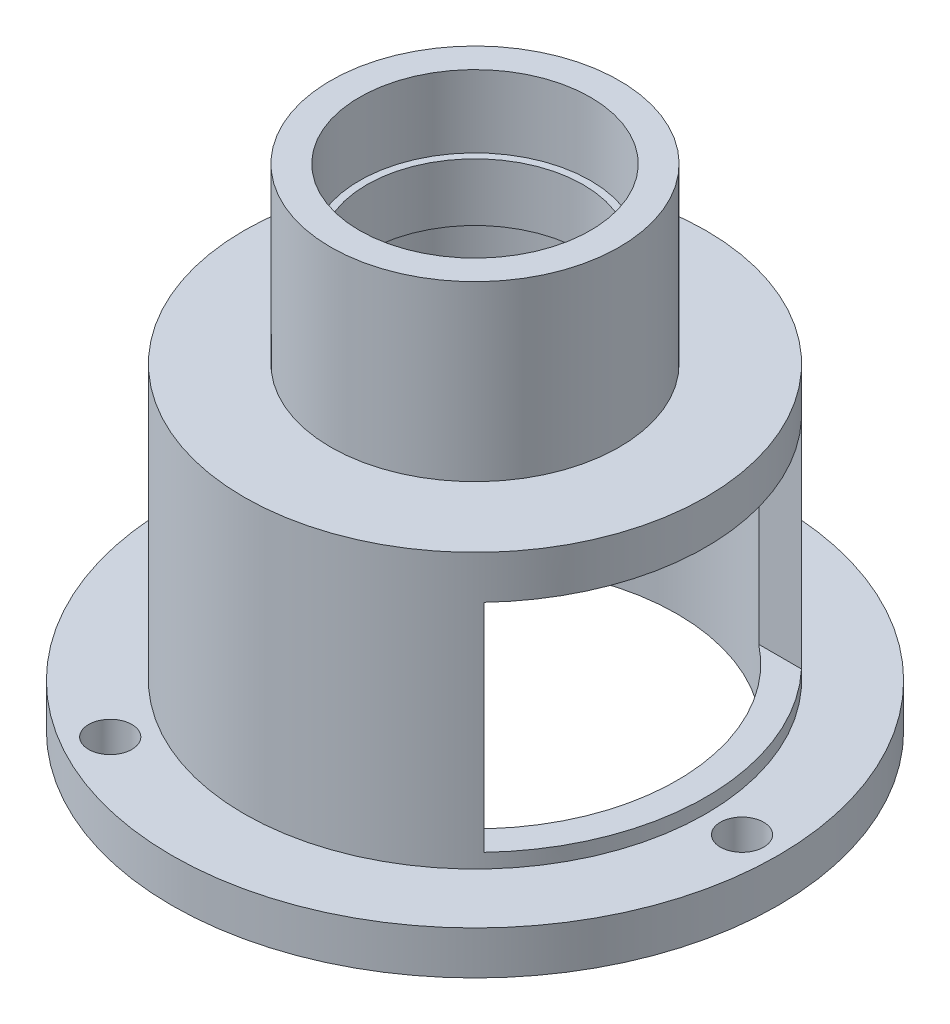
ISO-10303-21;
HEADER;
FILE_DESCRIPTION(('STEP AP214'),'2;1');
FILE_NAME('part.step','',(''),(''),'','','');
FILE_SCHEMA(('AUTOMOTIVE_DESIGN { 1 0 10303 214 1 1 1 1 }'));
ENDSEC;
DATA;
#1=APPLICATION_CONTEXT('core data for automotive mechanical design processes');
#2=APPLICATION_PROTOCOL_DEFINITION('international standard','automotive_design',2000,#1);
#3=PRODUCT_CONTEXT('',#1,'mechanical');
#4=PRODUCT('Part','Part','',(#3));
#5=PRODUCT_RELATED_PRODUCT_CATEGORY('part','',(#4));
#6=PRODUCT_DEFINITION_FORMATION('','',#4);
#7=PRODUCT_DEFINITION_CONTEXT('part definition',#1,'design');
#8=PRODUCT_DEFINITION('design','',#6,#7);
#9=PRODUCT_DEFINITION_SHAPE('','',#8);
#10=(LENGTH_UNIT() NAMED_UNIT(*) SI_UNIT(.MILLI.,.METRE.));
#11=(NAMED_UNIT(*) PLANE_ANGLE_UNIT() SI_UNIT($,.RADIAN.));
#12=(NAMED_UNIT(*) SI_UNIT($,.STERADIAN.) SOLID_ANGLE_UNIT());
#13=UNCERTAINTY_MEASURE_WITH_UNIT(LENGTH_MEASURE(1.E-05),#10,'distance_accuracy_value','');
#14=(GEOMETRIC_REPRESENTATION_CONTEXT(3) GLOBAL_UNCERTAINTY_ASSIGNED_CONTEXT((#13)) GLOBAL_UNIT_ASSIGNED_CONTEXT((#10,
#11,#12)) REPRESENTATION_CONTEXT('',''));
#15=CARTESIAN_POINT('',(0.,0.,0.));
#16=DIRECTION('',(0.,0.,1.));
#17=DIRECTION('',(1.,0.,0.));
#18=AXIS2_PLACEMENT_3D('',#15,#16,#17);
#19=CARTESIAN_POINT('',(0.,14.,0.));
#20=DIRECTION('',(0.,-1.,0.));
#21=DIRECTION('',(0.,0.,-1.));
#22=AXIS2_PLACEMENT_3D('',#19,#20,#21);
#23=CYLINDRICAL_SURFACE('',#22,16.);
#24=DIRECTION('',(0.,-1.,0.));
#25=VECTOR('',#24,1.);
#26=CARTESIAN_POINT('',(-11.6189500386223,14.,-11.));
#27=LINE('',#26,#25);
#28=CARTESIAN_POINT('',(-11.6189500386223,-16.,-11.));
#29=VERTEX_POINT('',#28);
#30=CARTESIAN_POINT('',(-11.6189500386222,-1.,-11.));
#31=VERTEX_POINT('',#30);
#32=EDGE_CURVE('E132',#29,#31,#27,.F.);
#33=ORIENTED_EDGE('',*,*,#32,.T.);
#34=CARTESIAN_POINT('',(0.,-0.999999999999997,0.));
#35=DIRECTION('',(0.,1.,0.));
#36=DIRECTION('',(-1.,0.,0.));
#37=AXIS2_PLACEMENT_3D('',#34,#35,#36);
#38=CIRCLE('',#37,16.);
#39=CARTESIAN_POINT('',(-11.6189500386222,-1.,11.));
#40=VERTEX_POINT('',#39);
#41=EDGE_CURVE('E135',#31,#40,#38,.T.);
#42=ORIENTED_EDGE('',*,*,#41,.T.);
#43=DIRECTION('',(0.,-1.,0.));
#44=VECTOR('',#43,1.);
#45=CARTESIAN_POINT('',(-11.6189500386223,14.,11.));
#46=LINE('',#45,#44);
#47=CARTESIAN_POINT('',(-11.6189500386223,-16.,11.));
#48=VERTEX_POINT('',#47);
#49=EDGE_CURVE('E125',#48,#40,#46,.F.);
#50=ORIENTED_EDGE('',*,*,#49,.F.);
#51=CARTESIAN_POINT('',(0.,-16.,0.));
#52=DIRECTION('',(0.,-1.,0.));
#53=DIRECTION('',(1.,0.,0.));
#54=AXIS2_PLACEMENT_3D('',#51,#52,#53);
#55=CIRCLE('',#54,16.);
#56=EDGE_CURVE('E137',#48,#29,#55,.T.);
#57=ORIENTED_EDGE('',*,*,#56,.T.);
#58=EDGE_LOOP('',(#33,#42,#50,#57));
#59=FACE_BOUND('',#58,.T.);
#60=CARTESIAN_POINT('',(0.,2.,0.));
#61=DIRECTION('',(0.,1.,0.));
#62=DIRECTION('',(0.,0.,1.));
#63=AXIS2_PLACEMENT_3D('',#60,#61,#62);
#64=CIRCLE('',#63,16.);
#65=CARTESIAN_POINT('',(0.,2.,16.));
#66=VERTEX_POINT('',#65);
#67=EDGE_CURVE('E176',#66,#66,#64,.T.);
#68=ORIENTED_EDGE('',*,*,#67,.F.);
#69=EDGE_LOOP('',(#68));
#70=FACE_BOUND('',#69,.T.);
#71=CARTESIAN_POINT('',(0.,-17.,0.));
#72=DIRECTION('',(0.,-1.,0.));
#73=DIRECTION('',(0.,0.,-1.));
#74=AXIS2_PLACEMENT_3D('',#71,#72,#73);
#75=CIRCLE('',#74,16.);
#76=CARTESIAN_POINT('',(0.,-17.,-16.));
#77=VERTEX_POINT('',#76);
#78=EDGE_CURVE('E163',#77,#77,#75,.T.);
#79=ORIENTED_EDGE('',*,*,#78,.F.);
#80=EDGE_LOOP('',(#79));
#81=FACE_BOUND('',#80,.T.);
#82=DIRECTION('',(0.,-1.,0.));
#83=VECTOR('',#82,1.);
#84=CARTESIAN_POINT('',(11.6189500386223,14.,-11.));
#85=LINE('',#84,#83);
#86=CARTESIAN_POINT('',(11.6189500386222,-1.,-11.));
#87=VERTEX_POINT('',#86);
#88=CARTESIAN_POINT('',(11.6189500386223,-16.,-11.));
#89=VERTEX_POINT('',#88);
#90=EDGE_CURVE('E98',#87,#89,#85,.T.);
#91=ORIENTED_EDGE('',*,*,#90,.T.);
#92=CARTESIAN_POINT('',(0.,-16.,0.));
#93=DIRECTION('',(0.,1.,0.));
#94=DIRECTION('',(-1.,0.,0.));
#95=AXIS2_PLACEMENT_3D('',#92,#93,#94);
#96=CIRCLE('',#95,16.);
#97=CARTESIAN_POINT('',(11.6189500386223,-16.,11.));
#98=VERTEX_POINT('',#97);
#99=EDGE_CURVE('E104',#98,#89,#96,.T.);
#100=ORIENTED_EDGE('',*,*,#99,.F.);
#101=DIRECTION('',(0.,-1.,0.));
#102=VECTOR('',#101,1.);
#103=CARTESIAN_POINT('',(11.6189500386223,14.,11.));
#104=LINE('',#103,#102);
#105=CARTESIAN_POINT('',(11.6189500386223,-0.999999999999997,11.));
#106=VERTEX_POINT('',#105);
#107=EDGE_CURVE('E94',#106,#98,#104,.T.);
#108=ORIENTED_EDGE('',*,*,#107,.F.);
#109=CARTESIAN_POINT('',(0.,-0.999999999999997,0.));
#110=DIRECTION('',(0.,-1.,0.));
#111=DIRECTION('',(1.,0.,0.));
#112=AXIS2_PLACEMENT_3D('',#109,#110,#111);
#113=CIRCLE('',#112,16.);
#114=EDGE_CURVE('E112',#87,#106,#113,.T.);
#115=ORIENTED_EDGE('',*,*,#114,.F.);
#116=EDGE_LOOP('',(#91,#100,#108,#115));
#117=FACE_BOUND('',#116,.T.);
#118=ADVANCED_FACE('F34',(#59,#70,#81,#117),#23,.T.);
#119=CARTESIAN_POINT('',(0.,14.,0.));
#120=DIRECTION('',(0.,-1.,0.));
#121=DIRECTION('',(0.,0.,-1.));
#122=AXIS2_PLACEMENT_3D('',#119,#120,#121);
#123=CYLINDRICAL_SURFACE('',#122,8.);
#124=CARTESIAN_POINT('',(0.,14.,0.));
#125=DIRECTION('',(0.,1.,0.));
#126=DIRECTION('',(0.,0.,1.));
#127=AXIS2_PLACEMENT_3D('',#124,#125,#126);
#128=CIRCLE('',#127,8.);
#129=CARTESIAN_POINT('',(0.,14.,8.));
#130=VERTEX_POINT('',#129);
#131=EDGE_CURVE('E180',#130,#130,#128,.T.);
#132=ORIENTED_EDGE('',*,*,#131,.T.);
#133=EDGE_LOOP('',(#132));
#134=FACE_BOUND('',#133,.T.);
#135=CARTESIAN_POINT('',(0.,9.,0.));
#136=DIRECTION('',(0.,-1.,0.));
#137=DIRECTION('',(0.,0.,-1.));
#138=AXIS2_PLACEMENT_3D('',#135,#136,#137);
#139=CIRCLE('',#138,8.);
#140=CARTESIAN_POINT('',(0.,9.,-8.));
#141=VERTEX_POINT('',#140);
#142=EDGE_CURVE('E170',#141,#141,#139,.T.);
#143=ORIENTED_EDGE('',*,*,#142,.T.);
#144=EDGE_LOOP('',(#143));
#145=FACE_BOUND('',#144,.T.);
#146=ADVANCED_FACE('F235',(#134,#145),#123,.F.);
#147=CARTESIAN_POINT('',(0.,14.,0.));
#148=DIRECTION('',(0.,1.,0.));
#149=DIRECTION('',(0.,0.,1.));
#150=AXIS2_PLACEMENT_3D('',#147,#148,#149);
#151=PLANE('',#150);
#152=ORIENTED_EDGE('',*,*,#131,.F.);
#153=EDGE_LOOP('',(#152));
#154=FACE_BOUND('',#153,.T.);
#155=CARTESIAN_POINT('',(0.,14.,0.));
#156=DIRECTION('',(0.,1.,0.));
#157=DIRECTION('',(0.,0.,1.));
#158=AXIS2_PLACEMENT_3D('',#155,#156,#157);
#159=CIRCLE('',#158,10.);
#160=CARTESIAN_POINT('',(0.,14.,10.));
#161=VERTEX_POINT('',#160);
#162=EDGE_CURVE('E177',#161,#161,#159,.T.);
#163=ORIENTED_EDGE('',*,*,#162,.T.);
#164=EDGE_LOOP('',(#163));
#165=FACE_BOUND('',#164,.T.);
#166=ADVANCED_FACE('F240',(#154,#165),#151,.T.);
#167=CARTESIAN_POINT('',(0.,0.,0.));
#168=DIRECTION('',(0.,1.,0.));
#169=DIRECTION('',(0.,0.,1.));
#170=AXIS2_PLACEMENT_3D('',#167,#168,#169);
#171=PLANE('',#170);
#172=CARTESIAN_POINT('',(0.,0.,0.));
#173=DIRECTION('',(0.,-1.,0.));
#174=DIRECTION('',(0.,0.,-1.));
#175=AXIS2_PLACEMENT_3D('',#172,#173,#174);
#176=CIRCLE('',#175,14.);
#177=CARTESIAN_POINT('',(0.,0.,-14.));
#178=VERTEX_POINT('',#177);
#179=EDGE_CURVE('E158',#178,#178,#176,.T.);
#180=ORIENTED_EDGE('',*,*,#179,.T.);
#181=EDGE_LOOP('',(#180));
#182=FACE_BOUND('',#181,.T.);
#183=CARTESIAN_POINT('',(0.,0.,0.));
#184=DIRECTION('',(0.,1.,0.));
#185=DIRECTION('',(0.,0.,1.));
#186=AXIS2_PLACEMENT_3D('',#183,#184,#185);
#187=CIRCLE('',#186,8.);
#188=CARTESIAN_POINT('',(0.,0.,8.));
#189=VERTEX_POINT('',#188);
#190=EDGE_CURVE('E184',#189,#189,#187,.T.);
#191=ORIENTED_EDGE('',*,*,#190,.T.);
#192=EDGE_LOOP('',(#191));
#193=FACE_BOUND('',#192,.T.);
#194=ADVANCED_FACE('F292',(#182,#193),#171,.F.);
#195=CARTESIAN_POINT('',(0.,5.,0.));
#196=DIRECTION('',(0.,-1.,0.));
#197=DIRECTION('',(0.,0.,-1.));
#198=AXIS2_PLACEMENT_3D('',#195,#196,#197);
#199=CIRCLE('',#198,8.);
#200=CARTESIAN_POINT('',(0.,5.,-8.));
#201=VERTEX_POINT('',#200);
#202=EDGE_CURVE('E183',#201,#201,#199,.T.);
#203=ORIENTED_EDGE('',*,*,#202,.F.);
#204=EDGE_LOOP('',(#203));
#205=FACE_BOUND('',#204,.T.);
#206=ORIENTED_EDGE('',*,*,#190,.F.);
#207=EDGE_LOOP('',(#206));
#208=FACE_BOUND('',#207,.T.);
#209=ADVANCED_FACE('F243',(#205,#208),#123,.F.);
#210=CARTESIAN_POINT('',(0.,2.,0.));
#211=DIRECTION('',(0.,1.,0.));
#212=DIRECTION('',(0.,0.,1.));
#213=AXIS2_PLACEMENT_3D('',#210,#211,#212);
#214=PLANE('',#213);
#215=CARTESIAN_POINT('',(0.,2.,0.));
#216=DIRECTION('',(0.,1.,0.));
#217=DIRECTION('',(0.,0.,1.));
#218=AXIS2_PLACEMENT_3D('',#215,#216,#217);
#219=CIRCLE('',#218,10.);
#220=CARTESIAN_POINT('',(0.,2.,10.));
#221=VERTEX_POINT('',#220);
#222=EDGE_CURVE('E173',#221,#221,#219,.T.);
#223=ORIENTED_EDGE('',*,*,#222,.F.);
#224=EDGE_LOOP('',(#223));
#225=FACE_BOUND('',#224,.T.);
#226=ORIENTED_EDGE('',*,*,#67,.T.);
#227=EDGE_LOOP('',(#226));
#228=FACE_BOUND('',#227,.T.);
#229=ADVANCED_FACE('F286',(#225,#228),#214,.T.);
#230=CARTESIAN_POINT('',(0.,2.,0.));
#231=DIRECTION('',(0.,1.,0.));
#232=DIRECTION('',(0.,0.,1.));
#233=AXIS2_PLACEMENT_3D('',#230,#231,#232);
#234=CYLINDRICAL_SURFACE('',#233,10.);
#235=ORIENTED_EDGE('',*,*,#222,.T.);
#236=EDGE_LOOP('',(#235));
#237=FACE_BOUND('',#236,.T.);
#238=ORIENTED_EDGE('',*,*,#162,.F.);
#239=EDGE_LOOP('',(#238));
#240=FACE_BOUND('',#239,.T.);
#241=ADVANCED_FACE('F279',(#237,#240),#234,.T.);
#242=CARTESIAN_POINT('',(0.,9.,0.));
#243=DIRECTION('',(0.,-1.,0.));
#244=DIRECTION('',(0.,0.,-1.));
#245=AXIS2_PLACEMENT_3D('',#242,#243,#244);
#246=PLANE('',#245);
#247=ORIENTED_EDGE('',*,*,#142,.F.);
#248=EDGE_LOOP('',(#247));
#249=FACE_BOUND('',#248,.T.);
#250=CARTESIAN_POINT('',(0.,9.,0.));
#251=DIRECTION('',(0.,-1.,0.));
#252=DIRECTION('',(0.,0.,-1.));
#253=AXIS2_PLACEMENT_3D('',#250,#251,#252);
#254=CIRCLE('',#253,7.5);
#255=CARTESIAN_POINT('',(0.,9.,-7.5));
#256=VERTEX_POINT('',#255);
#257=EDGE_CURVE('E167',#256,#256,#254,.T.);
#258=ORIENTED_EDGE('',*,*,#257,.T.);
#259=EDGE_LOOP('',(#258));
#260=FACE_BOUND('',#259,.T.);
#261=ADVANCED_FACE('F276',(#249,#260),#246,.F.);
#262=CARTESIAN_POINT('',(0.,5.,0.));
#263=DIRECTION('',(0.,-1.,0.));
#264=DIRECTION('',(0.,0.,-1.));
#265=AXIS2_PLACEMENT_3D('',#262,#263,#264);
#266=PLANE('',#265);
#267=ORIENTED_EDGE('',*,*,#202,.T.);
#268=EDGE_LOOP('',(#267));
#269=FACE_BOUND('',#268,.T.);
#270=CARTESIAN_POINT('',(0.,5.,0.));
#271=DIRECTION('',(0.,-1.,0.));
#272=DIRECTION('',(0.,0.,-1.));
#273=AXIS2_PLACEMENT_3D('',#270,#271,#272);
#274=CIRCLE('',#273,7.5);
#275=CARTESIAN_POINT('',(0.,5.,-7.5));
#276=VERTEX_POINT('',#275);
#277=EDGE_CURVE('E166',#276,#276,#274,.T.);
#278=ORIENTED_EDGE('',*,*,#277,.F.);
#279=EDGE_LOOP('',(#278));
#280=FACE_BOUND('',#279,.T.);
#281=ADVANCED_FACE('F274',(#269,#280),#266,.T.);
#282=CARTESIAN_POINT('',(0.,9.,0.));
#283=DIRECTION('',(0.,-1.,0.));
#284=DIRECTION('',(0.,0.,-1.));
#285=AXIS2_PLACEMENT_3D('',#282,#283,#284);
#286=CYLINDRICAL_SURFACE('',#285,7.5);
#287=ORIENTED_EDGE('',*,*,#257,.F.);
#288=EDGE_LOOP('',(#287));
#289=FACE_BOUND('',#288,.T.);
#290=ORIENTED_EDGE('',*,*,#277,.T.);
#291=EDGE_LOOP('',(#290));
#292=FACE_BOUND('',#291,.T.);
#293=ADVANCED_FACE('F262',(#289,#292),#286,.F.);
#294=CARTESIAN_POINT('',(0.,-17.,0.));
#295=DIRECTION('',(0.,1.,0.));
#296=DIRECTION('',(0.,0.,1.));
#297=AXIS2_PLACEMENT_3D('',#294,#295,#296);
#298=CYLINDRICAL_SURFACE('',#297,14.);
#299=DIRECTION('',(0.,1.,0.));
#300=VECTOR('',#299,1.);
#301=CARTESIAN_POINT('',(8.66025403784439,-17.,-11.));
#302=LINE('',#301,#300);
#303=CARTESIAN_POINT('',(8.66025403784439,-1.,-11.));
#304=VERTEX_POINT('',#303);
#305=CARTESIAN_POINT('',(8.66025403784439,-16.,-11.));
#306=VERTEX_POINT('',#305);
#307=EDGE_CURVE('E11',#304,#306,#302,.F.);
#308=ORIENTED_EDGE('',*,*,#307,.F.);
#309=CARTESIAN_POINT('',(0.,-0.999999999999997,0.));
#310=DIRECTION('',(0.,-1.,0.));
#311=DIRECTION('',(1.,0.,0.));
#312=AXIS2_PLACEMENT_3D('',#309,#310,#311);
#313=CIRCLE('',#312,14.);
#314=CARTESIAN_POINT('',(8.66025403784439,-1.,11.));
#315=VERTEX_POINT('',#314);
#316=EDGE_CURVE('E41',#304,#315,#313,.T.);
#317=ORIENTED_EDGE('',*,*,#316,.T.);
#318=DIRECTION('',(0.,1.,0.));
#319=VECTOR('',#318,1.);
#320=CARTESIAN_POINT('',(8.66025403784439,-17.,11.));
#321=LINE('',#320,#319);
#322=CARTESIAN_POINT('',(8.66025403784439,-16.,11.));
#323=VERTEX_POINT('',#322);
#324=EDGE_CURVE('E209',#315,#323,#321,.F.);
#325=ORIENTED_EDGE('',*,*,#324,.T.);
#326=CARTESIAN_POINT('',(0.,-16.,0.));
#327=DIRECTION('',(0.,1.,0.));
#328=DIRECTION('',(-1.,0.,0.));
#329=AXIS2_PLACEMENT_3D('',#326,#327,#328);
#330=CIRCLE('',#329,14.);
#331=EDGE_CURVE('E107',#323,#306,#330,.T.);
#332=ORIENTED_EDGE('',*,*,#331,.T.);
#333=EDGE_LOOP('',(#308,#317,#325,#332));
#334=FACE_BOUND('',#333,.T.);
#335=DIRECTION('',(0.,1.,0.));
#336=VECTOR('',#335,1.);
#337=CARTESIAN_POINT('',(-8.66025403784439,-17.,-11.));
#338=LINE('',#337,#336);
#339=CARTESIAN_POINT('',(-8.66025403784439,-16.,-11.));
#340=VERTEX_POINT('',#339);
#341=CARTESIAN_POINT('',(-8.66025403784439,-1.,-11.));
#342=VERTEX_POINT('',#341);
#343=EDGE_CURVE('E207',#340,#342,#338,.T.);
#344=ORIENTED_EDGE('',*,*,#343,.F.);
#345=CARTESIAN_POINT('',(0.,-16.,0.));
#346=DIRECTION('',(0.,-1.,0.));
#347=DIRECTION('',(1.,0.,0.));
#348=AXIS2_PLACEMENT_3D('',#345,#346,#347);
#349=CIRCLE('',#348,14.);
#350=CARTESIAN_POINT('',(-8.66025403784439,-16.,11.));
#351=VERTEX_POINT('',#350);
#352=EDGE_CURVE('E205',#351,#340,#349,.T.);
#353=ORIENTED_EDGE('',*,*,#352,.F.);
#354=DIRECTION('',(0.,1.,0.));
#355=VECTOR('',#354,1.);
#356=CARTESIAN_POINT('',(-8.66025403784439,-17.,11.));
#357=LINE('',#356,#355);
#358=CARTESIAN_POINT('',(-8.66025403784439,-0.999999999999997,11.));
#359=VERTEX_POINT('',#358);
#360=EDGE_CURVE('E191',#351,#359,#357,.T.);
#361=ORIENTED_EDGE('',*,*,#360,.T.);
#362=CARTESIAN_POINT('',(0.,-0.999999999999997,0.));
#363=DIRECTION('',(0.,1.,0.));
#364=DIRECTION('',(-1.,0.,0.));
#365=AXIS2_PLACEMENT_3D('',#362,#363,#364);
#366=CIRCLE('',#365,14.);
#367=EDGE_CURVE('E202',#342,#359,#366,.T.);
#368=ORIENTED_EDGE('',*,*,#367,.F.);
#369=EDGE_LOOP('',(#344,#353,#361,#368));
#370=FACE_BOUND('',#369,.T.);
#371=ORIENTED_EDGE('',*,*,#179,.F.);
#372=EDGE_LOOP('',(#371));
#373=FACE_BOUND('',#372,.T.);
#374=CARTESIAN_POINT('',(0.,-20.,0.));
#375=DIRECTION('',(0.,-1.,0.));
#376=DIRECTION('',(0.,0.,-1.));
#377=AXIS2_PLACEMENT_3D('',#374,#375,#376);
#378=CIRCLE('',#377,14.);
#379=CARTESIAN_POINT('',(0.,-20.,-14.));
#380=VERTEX_POINT('',#379);
#381=EDGE_CURVE('E151',#380,#380,#378,.T.);
#382=ORIENTED_EDGE('',*,*,#381,.T.);
#383=EDGE_LOOP('',(#382));
#384=FACE_BOUND('',#383,.T.);
#385=ADVANCED_FACE('F214',(#334,#370,#373,#384),#298,.F.);
#386=CARTESIAN_POINT('',(0.,-17.,0.));
#387=DIRECTION('',(0.,-1.,0.));
#388=DIRECTION('',(0.,0.,-1.));
#389=AXIS2_PLACEMENT_3D('',#386,#387,#388);
#390=PLANE('',#389);
#391=CARTESIAN_POINT('',(-9.24999999999985,-17.,-16.0214699700122));
#392=DIRECTION('',(0.,1.,0.));
#393=DIRECTION('',(0.,0.,1.));
#394=AXIS2_PLACEMENT_3D('',#391,#392,#393);
#395=CIRCLE('',#394,1.5);
#396=CARTESIAN_POINT('',(-9.24999999999985,-17.,-14.5214699700122));
#397=VERTEX_POINT('',#396);
#398=EDGE_CURVE('E139',#397,#397,#395,.T.);
#399=ORIENTED_EDGE('',*,*,#398,.F.);
#400=EDGE_LOOP('',(#399));
#401=FACE_BOUND('',#400,.T.);
#402=CARTESIAN_POINT('',(-9.25000000000008,-17.,16.0214699700121));
#403=DIRECTION('',(0.,1.,0.));
#404=DIRECTION('',(0.,0.,1.));
#405=AXIS2_PLACEMENT_3D('',#402,#403,#404);
#406=CIRCLE('',#405,1.5);
#407=CARTESIAN_POINT('',(-9.25000000000008,-17.,17.5214699700121));
#408=VERTEX_POINT('',#407);
#409=EDGE_CURVE('E143',#408,#408,#406,.T.);
#410=ORIENTED_EDGE('',*,*,#409,.F.);
#411=EDGE_LOOP('',(#410));
#412=FACE_BOUND('',#411,.T.);
#413=CARTESIAN_POINT('',(18.5,-17.,0.));
#414=DIRECTION('',(0.,1.,0.));
#415=DIRECTION('',(0.,0.,1.));
#416=AXIS2_PLACEMENT_3D('',#413,#414,#415);
#417=CIRCLE('',#416,1.5);
#418=CARTESIAN_POINT('',(18.5,-17.,1.5));
#419=VERTEX_POINT('',#418);
#420=EDGE_CURVE('E147',#419,#419,#417,.T.);
#421=ORIENTED_EDGE('',*,*,#420,.F.);
#422=EDGE_LOOP('',(#421));
#423=FACE_BOUND('',#422,.T.);
#424=CARTESIAN_POINT('',(0.,-17.,0.));
#425=DIRECTION('',(0.,-1.,0.));
#426=DIRECTION('',(0.,0.,-1.));
#427=AXIS2_PLACEMENT_3D('',#424,#425,#426);
#428=CIRCLE('',#427,21.);
#429=CARTESIAN_POINT('',(0.,-17.,-21.));
#430=VERTEX_POINT('',#429);
#431=EDGE_CURVE('E154',#430,#430,#428,.T.);
#432=ORIENTED_EDGE('',*,*,#431,.F.);
#433=EDGE_LOOP('',(#432));
#434=FACE_BOUND('',#433,.T.);
#435=ORIENTED_EDGE('',*,*,#78,.T.);
#436=EDGE_LOOP('',(#435));
#437=FACE_BOUND('',#436,.T.);
#438=ADVANCED_FACE('F250',(#401,#412,#423,#434,#437),#390,.F.);
#439=CARTESIAN_POINT('',(0.,-20.,0.));
#440=DIRECTION('',(0.,-1.,0.));
#441=DIRECTION('',(0.,0.,-1.));
#442=AXIS2_PLACEMENT_3D('',#439,#440,#441);
#443=PLANE('',#442);
#444=CARTESIAN_POINT('',(-9.24999999999985,-20.,-16.0214699700122));
#445=DIRECTION('',(0.,-1.,0.));
#446=DIRECTION('',(0.,0.,-1.));
#447=AXIS2_PLACEMENT_3D('',#444,#445,#446);
#448=CIRCLE('',#447,1.5);
#449=CARTESIAN_POINT('',(-9.24999999999985,-20.,-17.5214699700122));
#450=VERTEX_POINT('',#449);
#451=EDGE_CURVE('E142',#450,#450,#448,.T.);
#452=ORIENTED_EDGE('',*,*,#451,.F.);
#453=EDGE_LOOP('',(#452));
#454=FACE_BOUND('',#453,.T.);
#455=CARTESIAN_POINT('',(-9.25000000000008,-20.,16.0214699700121));
#456=DIRECTION('',(0.,-1.,0.));
#457=DIRECTION('',(0.,0.,-1.));
#458=AXIS2_PLACEMENT_3D('',#455,#456,#457);
#459=CIRCLE('',#458,1.5);
#460=CARTESIAN_POINT('',(-9.25000000000008,-20.,14.5214699700121));
#461=VERTEX_POINT('',#460);
#462=EDGE_CURVE('E146',#461,#461,#459,.T.);
#463=ORIENTED_EDGE('',*,*,#462,.F.);
#464=EDGE_LOOP('',(#463));
#465=FACE_BOUND('',#464,.T.);
#466=CARTESIAN_POINT('',(18.5,-20.,0.));
#467=DIRECTION('',(0.,-1.,0.));
#468=DIRECTION('',(0.,0.,-1.));
#469=AXIS2_PLACEMENT_3D('',#466,#467,#468);
#470=CIRCLE('',#469,1.5);
#471=CARTESIAN_POINT('',(18.5,-20.,-1.5));
#472=VERTEX_POINT('',#471);
#473=EDGE_CURVE('E150',#472,#472,#470,.T.);
#474=ORIENTED_EDGE('',*,*,#473,.F.);
#475=EDGE_LOOP('',(#474));
#476=FACE_BOUND('',#475,.T.);
#477=CARTESIAN_POINT('',(0.,-20.,0.));
#478=DIRECTION('',(0.,-1.,0.));
#479=DIRECTION('',(0.,0.,-1.));
#480=AXIS2_PLACEMENT_3D('',#477,#478,#479);
#481=CIRCLE('',#480,21.);
#482=CARTESIAN_POINT('',(0.,-20.,-21.));
#483=VERTEX_POINT('',#482);
#484=EDGE_CURVE('E155',#483,#483,#481,.T.);
#485=ORIENTED_EDGE('',*,*,#484,.T.);
#486=EDGE_LOOP('',(#485));
#487=FACE_BOUND('',#486,.T.);
#488=ORIENTED_EDGE('',*,*,#381,.F.);
#489=EDGE_LOOP('',(#488));
#490=FACE_BOUND('',#489,.T.);
#491=ADVANCED_FACE('F252',(#454,#465,#476,#487,#490),#443,.T.);
#492=CARTESIAN_POINT('',(0.,-20.,0.));
#493=DIRECTION('',(0.,1.,0.));
#494=DIRECTION('',(0.,0.,1.));
#495=AXIS2_PLACEMENT_3D('',#492,#493,#494);
#496=CYLINDRICAL_SURFACE('',#495,21.);
#497=ORIENTED_EDGE('',*,*,#484,.F.);
#498=EDGE_LOOP('',(#497));
#499=FACE_BOUND('',#498,.T.);
#500=ORIENTED_EDGE('',*,*,#431,.T.);
#501=EDGE_LOOP('',(#500));
#502=FACE_BOUND('',#501,.T.);
#503=ADVANCED_FACE('F259',(#499,#502),#496,.T.);
#504=CARTESIAN_POINT('',(18.5,-27.,0.));
#505=DIRECTION('',(0.,1.,0.));
#506=DIRECTION('',(0.,0.,1.));
#507=AXIS2_PLACEMENT_3D('',#504,#505,#506);
#508=CYLINDRICAL_SURFACE('',#507,1.5);
#509=ORIENTED_EDGE('',*,*,#473,.T.);
#510=EDGE_LOOP('',(#509));
#511=FACE_BOUND('',#510,.T.);
#512=ORIENTED_EDGE('',*,*,#420,.T.);
#513=EDGE_LOOP('',(#512));
#514=FACE_BOUND('',#513,.T.);
#515=ADVANCED_FACE('F269',(#511,#514),#508,.F.);
#516=CARTESIAN_POINT('',(-9.25000000000008,-27.,16.0214699700121));
#517=DIRECTION('',(0.,1.,0.));
#518=DIRECTION('',(0.,0.,1.));
#519=AXIS2_PLACEMENT_3D('',#516,#517,#518);
#520=CYLINDRICAL_SURFACE('',#519,1.5);
#521=ORIENTED_EDGE('',*,*,#462,.T.);
#522=EDGE_LOOP('',(#521));
#523=FACE_BOUND('',#522,.T.);
#524=ORIENTED_EDGE('',*,*,#409,.T.);
#525=EDGE_LOOP('',(#524));
#526=FACE_BOUND('',#525,.T.);
#527=ADVANCED_FACE('F409',(#523,#526),#520,.F.);
#528=CARTESIAN_POINT('',(-9.24999999999985,-27.,-16.0214699700122));
#529=DIRECTION('',(0.,1.,0.));
#530=DIRECTION('',(0.,0.,1.));
#531=AXIS2_PLACEMENT_3D('',#528,#529,#530);
#532=CYLINDRICAL_SURFACE('',#531,1.5);
#533=ORIENTED_EDGE('',*,*,#451,.T.);
#534=EDGE_LOOP('',(#533));
#535=FACE_BOUND('',#534,.T.);
#536=ORIENTED_EDGE('',*,*,#398,.T.);
#537=EDGE_LOOP('',(#536));
#538=FACE_BOUND('',#537,.T.);
#539=ADVANCED_FACE('F401',(#535,#538),#532,.F.);
#540=CARTESIAN_POINT('',(-1.,-16.,-11.));
#541=DIRECTION('',(0.,-1.,0.));
#542=DIRECTION('',(1.,0.,0.));
#543=AXIS2_PLACEMENT_3D('',#540,#541,#542);
#544=PLANE('',#543);
#545=DIRECTION('',(1.,0.,0.));
#546=VECTOR('',#545,1.);
#547=CARTESIAN_POINT('',(-1.,-16.,11.));
#548=LINE('',#547,#546);
#549=EDGE_CURVE('E122',#48,#351,#548,.T.);
#550=ORIENTED_EDGE('',*,*,#549,.T.);
#551=ORIENTED_EDGE('',*,*,#352,.T.);
#552=DIRECTION('',(1.,0.,0.));
#553=VECTOR('',#552,1.);
#554=CARTESIAN_POINT('',(-1.,-16.,-11.));
#555=LINE('',#554,#553);
#556=EDGE_CURVE('E121',#29,#340,#555,.T.);
#557=ORIENTED_EDGE('',*,*,#556,.F.);
#558=ORIENTED_EDGE('',*,*,#56,.F.);
#559=EDGE_LOOP('',(#550,#551,#557,#558));
#560=FACE_BOUND('',#559,.T.);
#561=ADVANCED_FACE('F393',(#560),#544,.F.);
#562=CARTESIAN_POINT('',(-1.,-0.999999999999997,-11.));
#563=DIRECTION('',(0.,1.,0.));
#564=DIRECTION('',(-1.,0.,0.));
#565=AXIS2_PLACEMENT_3D('',#562,#563,#564);
#566=PLANE('',#565);
#567=ORIENTED_EDGE('',*,*,#41,.F.);
#568=DIRECTION('',(-1.,0.,0.));
#569=VECTOR('',#568,1.);
#570=CARTESIAN_POINT('',(-1.,-0.999999999999997,-11.));
#571=LINE('',#570,#569);
#572=EDGE_CURVE('E118',#342,#31,#571,.T.);
#573=ORIENTED_EDGE('',*,*,#572,.F.);
#574=ORIENTED_EDGE('',*,*,#367,.T.);
#575=DIRECTION('',(-1.,0.,0.));
#576=VECTOR('',#575,1.);
#577=CARTESIAN_POINT('',(-1.,-0.999999999999997,11.));
#578=LINE('',#577,#576);
#579=EDGE_CURVE('E114',#359,#40,#578,.T.);
#580=ORIENTED_EDGE('',*,*,#579,.T.);
#581=EDGE_LOOP('',(#567,#573,#574,#580));
#582=FACE_BOUND('',#581,.T.);
#583=ADVANCED_FACE('F385',(#582),#566,.F.);
#584=CARTESIAN_POINT('',(0.,0.,-11.));
#585=DIRECTION('',(0.,0.,-1.));
#586=DIRECTION('',(-1.,0.,0.));
#587=AXIS2_PLACEMENT_3D('',#584,#585,#586);
#588=PLANE('',#587);
#589=ORIENTED_EDGE('',*,*,#556,.T.);
#590=ORIENTED_EDGE('',*,*,#343,.T.);
#591=ORIENTED_EDGE('',*,*,#572,.T.);
#592=ORIENTED_EDGE('',*,*,#32,.F.);
#593=EDGE_LOOP('',(#589,#590,#591,#592));
#594=FACE_BOUND('',#593,.T.);
#595=ADVANCED_FACE('F377',(#594),#588,.F.);
#596=CARTESIAN_POINT('',(0.,0.,11.));
#597=DIRECTION('',(0.,0.,-1.));
#598=DIRECTION('',(-1.,0.,0.));
#599=AXIS2_PLACEMENT_3D('',#596,#597,#598);
#600=PLANE('',#599);
#601=ORIENTED_EDGE('',*,*,#49,.T.);
#602=ORIENTED_EDGE('',*,*,#579,.F.);
#603=ORIENTED_EDGE('',*,*,#360,.F.);
#604=ORIENTED_EDGE('',*,*,#549,.F.);
#605=EDGE_LOOP('',(#601,#602,#603,#604));
#606=FACE_BOUND('',#605,.T.);
#607=ADVANCED_FACE('F354',(#606),#600,.T.);
#608=CARTESIAN_POINT('',(1.,-0.999999999999997,-11.));
#609=DIRECTION('',(0.,-1.,0.));
#610=DIRECTION('',(1.,0.,0.));
#611=AXIS2_PLACEMENT_3D('',#608,#609,#610);
#612=PLANE('',#611);
#613=ORIENTED_EDGE('',*,*,#114,.T.);
#614=DIRECTION('',(1.,0.,0.));
#615=VECTOR('',#614,1.);
#616=CARTESIAN_POINT('',(1.,-0.999999999999997,11.));
#617=LINE('',#616,#615);
#618=EDGE_CURVE('E48',#315,#106,#617,.T.);
#619=ORIENTED_EDGE('',*,*,#618,.F.);
#620=ORIENTED_EDGE('',*,*,#316,.F.);
#621=DIRECTION('',(1.,0.,0.));
#622=VECTOR('',#621,1.);
#623=CARTESIAN_POINT('',(1.,-0.999999999999997,-11.));
#624=LINE('',#623,#622);
#625=EDGE_CURVE('E99',#304,#87,#624,.T.);
#626=ORIENTED_EDGE('',*,*,#625,.T.);
#627=EDGE_LOOP('',(#613,#619,#620,#626));
#628=FACE_BOUND('',#627,.T.);
#629=ADVANCED_FACE('F219',(#628),#612,.T.);
#630=CARTESIAN_POINT('',(1.,-16.,-11.));
#631=DIRECTION('',(0.,1.,0.));
#632=DIRECTION('',(-1.,0.,0.));
#633=AXIS2_PLACEMENT_3D('',#630,#631,#632);
#634=PLANE('',#633);
#635=ORIENTED_EDGE('',*,*,#99,.T.);
#636=DIRECTION('',(-1.,0.,0.));
#637=VECTOR('',#636,1.);
#638=CARTESIAN_POINT('',(1.,-16.,-11.));
#639=LINE('',#638,#637);
#640=EDGE_CURVE('E222',#89,#306,#639,.T.);
#641=ORIENTED_EDGE('',*,*,#640,.T.);
#642=ORIENTED_EDGE('',*,*,#331,.F.);
#643=DIRECTION('',(-1.,0.,0.));
#644=VECTOR('',#643,1.);
#645=CARTESIAN_POINT('',(1.,-16.,11.));
#646=LINE('',#645,#644);
#647=EDGE_CURVE('E53',#98,#323,#646,.T.);
#648=ORIENTED_EDGE('',*,*,#647,.F.);
#649=EDGE_LOOP('',(#635,#641,#642,#648));
#650=FACE_BOUND('',#649,.T.);
#651=ADVANCED_FACE('F102',(#650),#634,.T.);
#652=CARTESIAN_POINT('',(0.,0.,-11.));
#653=DIRECTION('',(0.,0.,-1.));
#654=DIRECTION('',(1.,0.,0.));
#655=AXIS2_PLACEMENT_3D('',#652,#653,#654);
#656=PLANE('',#655);
#657=ORIENTED_EDGE('',*,*,#625,.F.);
#658=ORIENTED_EDGE('',*,*,#307,.T.);
#659=ORIENTED_EDGE('',*,*,#640,.F.);
#660=ORIENTED_EDGE('',*,*,#90,.F.);
#661=EDGE_LOOP('',(#657,#658,#659,#660));
#662=FACE_BOUND('',#661,.T.);
#663=ADVANCED_FACE('F221',(#662),#656,.F.);
#664=CARTESIAN_POINT('',(0.,0.,11.));
#665=DIRECTION('',(0.,0.,-1.));
#666=DIRECTION('',(1.,0.,0.));
#667=AXIS2_PLACEMENT_3D('',#664,#665,#666);
#668=PLANE('',#667);
#669=ORIENTED_EDGE('',*,*,#107,.T.);
#670=ORIENTED_EDGE('',*,*,#647,.T.);
#671=ORIENTED_EDGE('',*,*,#324,.F.);
#672=ORIENTED_EDGE('',*,*,#618,.T.);
#673=EDGE_LOOP('',(#669,#670,#671,#672));
#674=FACE_BOUND('',#673,.T.);
#675=ADVANCED_FACE('F95',(#674),#668,.T.);
#676=CLOSED_SHELL('',(#118,#146,#166,#194,#209,#229,#241,#261,#281,#293,#385,#438,#491,#503,
#515,#527,#539,#561,#583,#595,#607,#629,#651,#663,#675));
#677=MANIFOLD_SOLID_BREP('B2',#676);
#678=ADVANCED_BREP_SHAPE_REPRESENTATION('',(#18,#677),#14);
#679=SHAPE_DEFINITION_REPRESENTATION(#9,#678);
ENDSEC;
END-ISO-10303-21;
